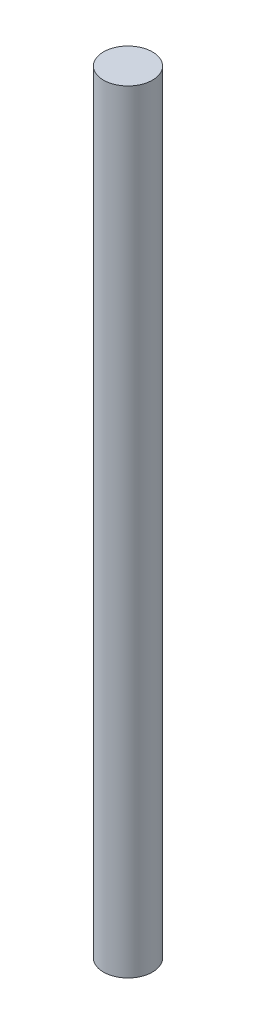
ISO-10303-21;
HEADER;
FILE_DESCRIPTION(('STEP AP214'),'2;1');
FILE_NAME('part.step','',(''),(''),'','','');
FILE_SCHEMA(('AUTOMOTIVE_DESIGN { 1 0 10303 214 1 1 1 1 }'));
ENDSEC;
DATA;
#1=APPLICATION_CONTEXT('core data for automotive mechanical design processes');
#2=APPLICATION_PROTOCOL_DEFINITION('international standard','automotive_design',2000,#1);
#3=PRODUCT_CONTEXT('',#1,'mechanical');
#4=PRODUCT('Part','Part','',(#3));
#5=PRODUCT_RELATED_PRODUCT_CATEGORY('part','',(#4));
#6=PRODUCT_DEFINITION_FORMATION('','',#4);
#7=PRODUCT_DEFINITION_CONTEXT('part definition',#1,'design');
#8=PRODUCT_DEFINITION('design','',#6,#7);
#9=PRODUCT_DEFINITION_SHAPE('','',#8);
#10=(LENGTH_UNIT() NAMED_UNIT(*) SI_UNIT(.MILLI.,.METRE.));
#11=(NAMED_UNIT(*) PLANE_ANGLE_UNIT() SI_UNIT($,.RADIAN.));
#12=(NAMED_UNIT(*) SI_UNIT($,.STERADIAN.) SOLID_ANGLE_UNIT());
#13=UNCERTAINTY_MEASURE_WITH_UNIT(LENGTH_MEASURE(1.E-05),#10,'distance_accuracy_value','');
#14=(GEOMETRIC_REPRESENTATION_CONTEXT(3) GLOBAL_UNCERTAINTY_ASSIGNED_CONTEXT((#13)) GLOBAL_UNIT_ASSIGNED_CONTEXT((#10,
#11,#12)) REPRESENTATION_CONTEXT('',''));
#15=CARTESIAN_POINT('',(0.,0.,0.));
#16=DIRECTION('',(0.,0.,1.));
#17=DIRECTION('',(1.,0.,0.));
#18=AXIS2_PLACEMENT_3D('',#15,#16,#17);
#19=CARTESIAN_POINT('',(0.,126.2,0.));
#20=DIRECTION('',(0.,-1.,0.));
#21=DIRECTION('',(0.,0.,-1.));
#22=AXIS2_PLACEMENT_3D('',#19,#20,#21);
#23=CYLINDRICAL_SURFACE('',#22,4.);
#24=CARTESIAN_POINT('',(0.,126.2,0.));
#25=DIRECTION('',(0.,1.,0.));
#26=DIRECTION('',(0.,0.,1.));
#27=AXIS2_PLACEMENT_3D('',#24,#25,#26);
#28=CIRCLE('',#27,4.);
#29=CARTESIAN_POINT('',(0.,126.2,4.));
#30=VERTEX_POINT('',#29);
#31=EDGE_CURVE('E10',#30,#30,#28,.T.);
#32=ORIENTED_EDGE('',*,*,#31,.F.);
#33=EDGE_LOOP('',(#32));
#34=FACE_BOUND('',#33,.T.);
#35=CARTESIAN_POINT('',(0.,0.,0.));
#36=DIRECTION('',(0.,1.,0.));
#37=DIRECTION('',(0.,0.,1.));
#38=AXIS2_PLACEMENT_3D('',#35,#36,#37);
#39=CIRCLE('',#38,4.);
#40=CARTESIAN_POINT('',(0.,0.,4.));
#41=VERTEX_POINT('',#40);
#42=EDGE_CURVE('E40',#41,#41,#39,.T.);
#43=ORIENTED_EDGE('',*,*,#42,.T.);
#44=EDGE_LOOP('',(#43));
#45=FACE_BOUND('',#44,.T.);
#46=ADVANCED_FACE('F37',(#34,#45),#23,.T.);
#47=CARTESIAN_POINT('',(0.,126.2,0.));
#48=DIRECTION('',(0.,1.,0.));
#49=DIRECTION('',(0.,0.,1.));
#50=AXIS2_PLACEMENT_3D('',#47,#48,#49);
#51=PLANE('',#50);
#52=ORIENTED_EDGE('',*,*,#31,.T.);
#53=EDGE_LOOP('',(#52));
#54=FACE_BOUND('',#53,.T.);
#55=ADVANCED_FACE('F52',(#54),#51,.T.);
#56=CARTESIAN_POINT('',(0.,0.,0.));
#57=DIRECTION('',(0.,1.,0.));
#58=DIRECTION('',(0.,0.,1.));
#59=AXIS2_PLACEMENT_3D('',#56,#57,#58);
#60=PLANE('',#59);
#61=ORIENTED_EDGE('',*,*,#42,.F.);
#62=EDGE_LOOP('',(#61));
#63=FACE_BOUND('',#62,.T.);
#64=ADVANCED_FACE('F50',(#63),#60,.F.);
#65=CLOSED_SHELL('',(#46,#55,#64));
#66=MANIFOLD_SOLID_BREP('B2',#65);
#67=ADVANCED_BREP_SHAPE_REPRESENTATION('',(#18,#66),#14);
#68=SHAPE_DEFINITION_REPRESENTATION(#9,#67);
ENDSEC;
END-ISO-10303-21;
